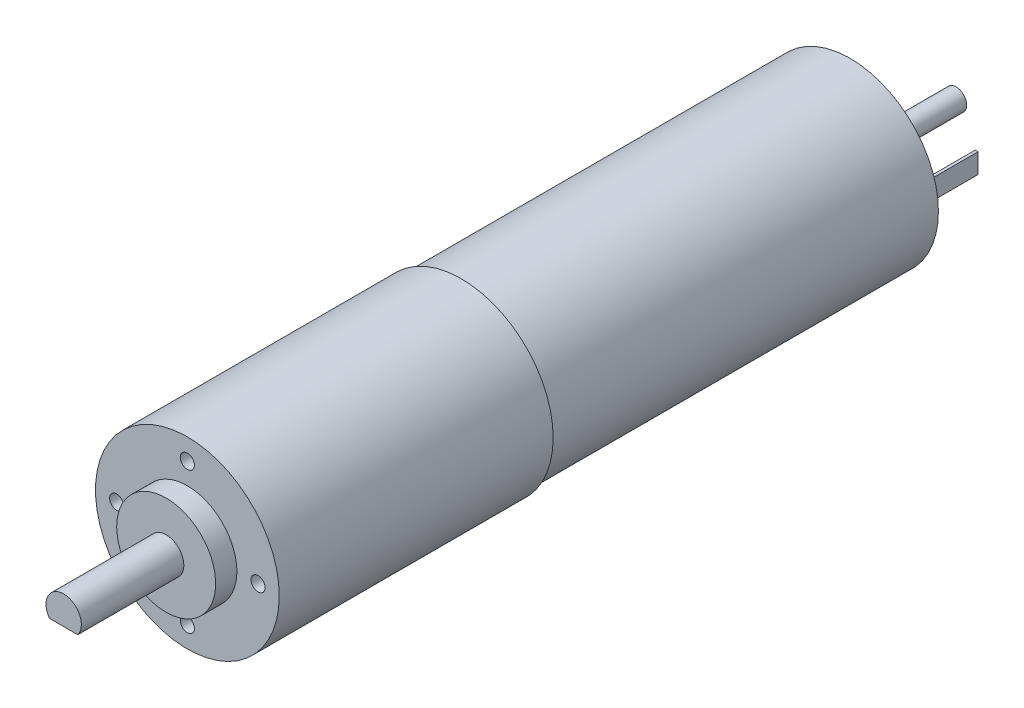
ISO-10303-21;
HEADER;
FILE_DESCRIPTION(('STEP AP214'),'2;1');
FILE_NAME('part.step','',(''),(''),'','','');
FILE_SCHEMA(('AUTOMOTIVE_DESIGN { 1 0 10303 214 1 1 1 1 }'));
ENDSEC;
DATA;
#1=APPLICATION_CONTEXT('core data for automotive mechanical design processes');
#2=APPLICATION_PROTOCOL_DEFINITION('international standard','automotive_design',2000,#1);
#3=PRODUCT_CONTEXT('',#1,'mechanical');
#4=PRODUCT('Part','Part','',(#3));
#5=PRODUCT_RELATED_PRODUCT_CATEGORY('part','',(#4));
#6=PRODUCT_DEFINITION_FORMATION('','',#4);
#7=PRODUCT_DEFINITION_CONTEXT('part definition',#1,'design');
#8=PRODUCT_DEFINITION('design','',#6,#7);
#9=PRODUCT_DEFINITION_SHAPE('','',#8);
#10=(LENGTH_UNIT() NAMED_UNIT(*) SI_UNIT(.MILLI.,.METRE.));
#11=(NAMED_UNIT(*) PLANE_ANGLE_UNIT() SI_UNIT($,.RADIAN.));
#12=(NAMED_UNIT(*) SI_UNIT($,.STERADIAN.) SOLID_ANGLE_UNIT());
#13=UNCERTAINTY_MEASURE_WITH_UNIT(LENGTH_MEASURE(1.E-05),#10,'distance_accuracy_value','');
#14=(GEOMETRIC_REPRESENTATION_CONTEXT(3) GLOBAL_UNCERTAINTY_ASSIGNED_CONTEXT((#13)) GLOBAL_UNIT_ASSIGNED_CONTEXT((#10,
#11,#12)) REPRESENTATION_CONTEXT('',''));
#15=CARTESIAN_POINT('',(0.,0.,0.));
#16=DIRECTION('',(0.,0.,1.));
#17=DIRECTION('',(1.,0.,0.));
#18=AXIS2_PLACEMENT_3D('',#15,#16,#17);
#19=CARTESIAN_POINT('',(0.,0.,0.));
#20=DIRECTION('',(0.,0.,1.));
#21=DIRECTION('',(1.,0.,0.));
#22=AXIS2_PLACEMENT_3D('',#19,#20,#21);
#23=PLANE('',#22);
#24=CARTESIAN_POINT('',(0.,0.,0.));
#25=DIRECTION('',(0.,0.,1.));
#26=DIRECTION('',(1.,0.,0.));
#27=AXIS2_PLACEMENT_3D('',#24,#25,#26);
#28=CIRCLE('',#27,12.5);
#29=CARTESIAN_POINT('',(12.5,0.,0.));
#30=VERTEX_POINT('',#29);
#31=EDGE_CURVE('E246',#30,#30,#28,.T.);
#32=ORIENTED_EDGE('',*,*,#31,.F.);
#33=EDGE_LOOP('',(#32));
#34=FACE_BOUND('',#33,.T.);
#35=CARTESIAN_POINT('',(0.,0.,0.));
#36=DIRECTION('',(0.,0.,-1.));
#37=DIRECTION('',(-1.,0.,0.));
#38=AXIS2_PLACEMENT_3D('',#35,#36,#37);
#39=CIRCLE('',#38,4.);
#40=CARTESIAN_POINT('',(-4.,0.,0.));
#41=VERTEX_POINT('',#40);
#42=EDGE_CURVE('E11',#41,#41,#39,.T.);
#43=ORIENTED_EDGE('',*,*,#42,.F.);
#44=EDGE_LOOP('',(#43));
#45=FACE_BOUND('',#44,.T.);
#46=DIRECTION('',(1.,0.,0.));
#47=VECTOR('',#46,1.);
#48=CARTESIAN_POINT('',(0.,-1.40000000000001,0.));
#49=LINE('',#48,#47);
#50=CARTESIAN_POINT('',(-9.4,-1.4,0.));
#51=VERTEX_POINT('',#50);
#52=CARTESIAN_POINT('',(-9.,-1.4,0.));
#53=VERTEX_POINT('',#52);
#54=EDGE_CURVE('E186',#51,#53,#49,.T.);
#55=ORIENTED_EDGE('',*,*,#54,.T.);
#56=DIRECTION('',(0.,1.,0.));
#57=VECTOR('',#56,1.);
#58=CARTESIAN_POINT('',(-9.,0.,0.));
#59=LINE('',#58,#57);
#60=CARTESIAN_POINT('',(-9.,1.4,0.));
#61=VERTEX_POINT('',#60);
#62=EDGE_CURVE('E169',#53,#61,#59,.T.);
#63=ORIENTED_EDGE('',*,*,#62,.T.);
#64=DIRECTION('',(-1.,0.,0.));
#65=VECTOR('',#64,1.);
#66=CARTESIAN_POINT('',(0.,1.40000000000001,0.));
#67=LINE('',#66,#65);
#68=CARTESIAN_POINT('',(-9.4,1.4,0.));
#69=VERTEX_POINT('',#68);
#70=EDGE_CURVE('E174',#61,#69,#67,.T.);
#71=ORIENTED_EDGE('',*,*,#70,.T.);
#72=DIRECTION('',(0.,-1.,0.));
#73=VECTOR('',#72,1.);
#74=CARTESIAN_POINT('',(-9.4,0.,0.));
#75=LINE('',#74,#73);
#76=EDGE_CURVE('E189',#69,#51,#75,.T.);
#77=ORIENTED_EDGE('',*,*,#76,.T.);
#78=EDGE_LOOP('',(#55,#63,#71,#77));
#79=FACE_BOUND('',#78,.T.);
#80=DIRECTION('',(-1.,0.,0.));
#81=VECTOR('',#80,1.);
#82=CARTESIAN_POINT('',(0.,-1.40000000000001,0.));
#83=LINE('',#82,#81);
#84=CARTESIAN_POINT('',(9.4,-1.4,0.));
#85=VERTEX_POINT('',#84);
#86=CARTESIAN_POINT('',(9.,-1.4,0.));
#87=VERTEX_POINT('',#86);
#88=EDGE_CURVE('E136',#85,#87,#83,.T.);
#89=ORIENTED_EDGE('',*,*,#88,.F.);
#90=DIRECTION('',(0.,-1.,0.));
#91=VECTOR('',#90,1.);
#92=CARTESIAN_POINT('',(9.4,0.,0.));
#93=LINE('',#92,#91);
#94=CARTESIAN_POINT('',(9.4,1.4,0.));
#95=VERTEX_POINT('',#94);
#96=EDGE_CURVE('E144',#95,#85,#93,.T.);
#97=ORIENTED_EDGE('',*,*,#96,.F.);
#98=DIRECTION('',(1.,0.,0.));
#99=VECTOR('',#98,1.);
#100=CARTESIAN_POINT('',(0.,1.40000000000001,0.));
#101=LINE('',#100,#99);
#102=CARTESIAN_POINT('',(9.,1.4,0.));
#103=VERTEX_POINT('',#102);
#104=EDGE_CURVE('E154',#103,#95,#101,.T.);
#105=ORIENTED_EDGE('',*,*,#104,.F.);
#106=DIRECTION('',(0.,1.,0.));
#107=VECTOR('',#106,1.);
#108=CARTESIAN_POINT('',(9.,0.,0.));
#109=LINE('',#108,#107);
#110=EDGE_CURVE('E65',#87,#103,#109,.T.);
#111=ORIENTED_EDGE('',*,*,#110,.F.);
#112=EDGE_LOOP('',(#89,#97,#105,#111));
#113=FACE_BOUND('',#112,.T.);
#114=ADVANCED_FACE('F40',(#34,#45,#79,#113),#23,.F.);
#115=CARTESIAN_POINT('',(0.,0.,55.));
#116=DIRECTION('',(0.,0.,-1.));
#117=DIRECTION('',(-1.,0.,0.));
#118=AXIS2_PLACEMENT_3D('',#115,#116,#117);
#119=CYLINDRICAL_SURFACE('',#118,12.5);
#120=CARTESIAN_POINT('',(0.,0.,55.));
#121=DIRECTION('',(0.,0.,1.));
#122=DIRECTION('',(1.,0.,0.));
#123=AXIS2_PLACEMENT_3D('',#120,#121,#122);
#124=CIRCLE('',#123,12.5);
#125=CARTESIAN_POINT('',(12.5,0.,55.));
#126=VERTEX_POINT('',#125);
#127=EDGE_CURVE('E242',#126,#126,#124,.T.);
#128=ORIENTED_EDGE('',*,*,#127,.F.);
#129=EDGE_LOOP('',(#128));
#130=FACE_BOUND('',#129,.T.);
#131=ORIENTED_EDGE('',*,*,#31,.T.);
#132=EDGE_LOOP('',(#131));
#133=FACE_BOUND('',#132,.T.);
#134=ADVANCED_FACE('F42',(#130,#133),#119,.T.);
#135=CARTESIAN_POINT('',(0.,0.,93.75));
#136=DIRECTION('',(0.,0.,-1.));
#137=DIRECTION('',(-1.,0.,0.));
#138=AXIS2_PLACEMENT_3D('',#135,#136,#137);
#139=CYLINDRICAL_SURFACE('',#138,13.);
#140=CARTESIAN_POINT('',(0.,0.,93.75));
#141=DIRECTION('',(0.,0.,1.));
#142=DIRECTION('',(1.,0.,0.));
#143=AXIS2_PLACEMENT_3D('',#140,#141,#142);
#144=CIRCLE('',#143,13.);
#145=CARTESIAN_POINT('',(13.,0.,93.75));
#146=VERTEX_POINT('',#145);
#147=EDGE_CURVE('E243',#146,#146,#144,.T.);
#148=ORIENTED_EDGE('',*,*,#147,.F.);
#149=EDGE_LOOP('',(#148));
#150=FACE_BOUND('',#149,.T.);
#151=CARTESIAN_POINT('',(0.,0.,55.));
#152=DIRECTION('',(0.,0.,1.));
#153=DIRECTION('',(1.,0.,0.));
#154=AXIS2_PLACEMENT_3D('',#151,#152,#153);
#155=CIRCLE('',#154,13.);
#156=CARTESIAN_POINT('',(13.,0.,55.));
#157=VERTEX_POINT('',#156);
#158=EDGE_CURVE('E239',#157,#157,#155,.T.);
#159=ORIENTED_EDGE('',*,*,#158,.T.);
#160=EDGE_LOOP('',(#159));
#161=FACE_BOUND('',#160,.T.);
#162=ADVANCED_FACE('F372',(#150,#161),#139,.T.);
#163=CARTESIAN_POINT('',(0.,0.,93.75));
#164=DIRECTION('',(0.,0.,1.));
#165=DIRECTION('',(1.,0.,0.));
#166=AXIS2_PLACEMENT_3D('',#163,#164,#165);
#167=PLANE('',#166);
#168=CARTESIAN_POINT('',(0.,10.,93.75));
#169=DIRECTION('',(0.,0.,1.));
#170=DIRECTION('',(1.,0.,0.));
#171=AXIS2_PLACEMENT_3D('',#168,#169,#170);
#172=CIRCLE('',#171,1.);
#173=CARTESIAN_POINT('',(1.,10.,93.75));
#174=VERTEX_POINT('',#173);
#175=EDGE_CURVE('E212',#174,#174,#172,.T.);
#176=ORIENTED_EDGE('',*,*,#175,.F.);
#177=EDGE_LOOP('',(#176));
#178=FACE_BOUND('',#177,.T.);
#179=CARTESIAN_POINT('',(10.,0.,93.75));
#180=DIRECTION('',(0.,0.,1.));
#181=DIRECTION('',(1.,0.,0.));
#182=AXIS2_PLACEMENT_3D('',#179,#180,#181);
#183=CIRCLE('',#182,0.999999999999999);
#184=CARTESIAN_POINT('',(11.,0.,93.75));
#185=VERTEX_POINT('',#184);
#186=EDGE_CURVE('E218',#185,#185,#183,.T.);
#187=ORIENTED_EDGE('',*,*,#186,.F.);
#188=EDGE_LOOP('',(#187));
#189=FACE_BOUND('',#188,.T.);
#190=CARTESIAN_POINT('',(0.,-10.,93.75));
#191=DIRECTION('',(0.,0.,1.));
#192=DIRECTION('',(1.,0.,0.));
#193=AXIS2_PLACEMENT_3D('',#190,#191,#192);
#194=CIRCLE('',#193,1.);
#195=CARTESIAN_POINT('',(1.,-10.,93.75));
#196=VERTEX_POINT('',#195);
#197=EDGE_CURVE('E224',#196,#196,#194,.T.);
#198=ORIENTED_EDGE('',*,*,#197,.F.);
#199=EDGE_LOOP('',(#198));
#200=FACE_BOUND('',#199,.T.);
#201=CARTESIAN_POINT('',(-10.,0.,93.75));
#202=DIRECTION('',(0.,0.,1.));
#203=DIRECTION('',(1.,0.,0.));
#204=AXIS2_PLACEMENT_3D('',#201,#202,#203);
#205=CIRCLE('',#204,0.999999999999999);
#206=CARTESIAN_POINT('',(-9.,0.,93.75));
#207=VERTEX_POINT('',#206);
#208=EDGE_CURVE('E207',#207,#207,#205,.T.);
#209=ORIENTED_EDGE('',*,*,#208,.F.);
#210=EDGE_LOOP('',(#209));
#211=FACE_BOUND('',#210,.T.);
#212=CARTESIAN_POINT('',(0.,0.,93.75));
#213=DIRECTION('',(0.,0.,1.));
#214=DIRECTION('',(1.,0.,0.));
#215=AXIS2_PLACEMENT_3D('',#212,#213,#214);
#216=CIRCLE('',#215,7.);
#217=CARTESIAN_POINT('',(-7.,0.,93.75));
#218=VERTEX_POINT('',#217);
#219=EDGE_CURVE('E236',#218,#218,#216,.T.);
#220=ORIENTED_EDGE('',*,*,#219,.F.);
#221=EDGE_LOOP('',(#220));
#222=FACE_BOUND('',#221,.T.);
#223=ORIENTED_EDGE('',*,*,#147,.T.);
#224=EDGE_LOOP('',(#223));
#225=FACE_BOUND('',#224,.T.);
#226=ADVANCED_FACE('F369',(#178,#189,#200,#211,#222,#225),#167,.T.);
#227=CARTESIAN_POINT('',(0.,0.,55.));
#228=DIRECTION('',(0.,0.,1.));
#229=DIRECTION('',(1.,0.,0.));
#230=AXIS2_PLACEMENT_3D('',#227,#228,#229);
#231=PLANE('',#230);
#232=ORIENTED_EDGE('',*,*,#127,.T.);
#233=EDGE_LOOP('',(#232));
#234=FACE_BOUND('',#233,.T.);
#235=ORIENTED_EDGE('',*,*,#158,.F.);
#236=EDGE_LOOP('',(#235));
#237=FACE_BOUND('',#236,.T.);
#238=ADVANCED_FACE('F367',(#234,#237),#231,.F.);
#239=CARTESIAN_POINT('',(0.,0.,96.75));
#240=DIRECTION('',(0.,0.,-1.));
#241=DIRECTION('',(-1.,0.,0.));
#242=AXIS2_PLACEMENT_3D('',#239,#240,#241);
#243=CYLINDRICAL_SURFACE('',#242,7.);
#244=CARTESIAN_POINT('',(0.,0.,96.75));
#245=DIRECTION('',(0.,0.,1.));
#246=DIRECTION('',(1.,0.,0.));
#247=AXIS2_PLACEMENT_3D('',#244,#245,#246);
#248=CIRCLE('',#247,7.);
#249=CARTESIAN_POINT('',(-7.,0.,96.75));
#250=VERTEX_POINT('',#249);
#251=EDGE_CURVE('E233',#250,#250,#248,.T.);
#252=CARTESIAN_POINT('',(-7.,0.,96.75));
#253=CARTESIAN_POINT('',(-7.,0.,96.71875));
#254=CARTESIAN_POINT('',(-7.,0.,96.6875));
#255=CARTESIAN_POINT('',(-7.,0.,96.625));
#256=CARTESIAN_POINT('',(-7.,0.,96.59375));
#257=CARTESIAN_POINT('',(-7.,0.,96.53125));
#258=CARTESIAN_POINT('',(-7.,0.,96.5));
#259=CARTESIAN_POINT('',(-7.,0.,96.4375));
#260=CARTESIAN_POINT('',(-7.,0.,96.40625));
#261=CARTESIAN_POINT('',(-7.,0.,96.34375));
#262=CARTESIAN_POINT('',(-7.,0.,96.3125));
#263=CARTESIAN_POINT('',(-7.,0.,96.25));
#264=CARTESIAN_POINT('',(-7.,0.,96.21875));
#265=CARTESIAN_POINT('',(-7.,0.,96.15625));
#266=CARTESIAN_POINT('',(-7.,0.,96.125));
#267=CARTESIAN_POINT('',(-7.,0.,96.0625));
#268=CARTESIAN_POINT('',(-7.,0.,96.03125));
#269=CARTESIAN_POINT('',(-7.,0.,95.96875));
#270=CARTESIAN_POINT('',(-7.,0.,95.9375));
#271=CARTESIAN_POINT('',(-7.,0.,95.875));
#272=CARTESIAN_POINT('',(-7.,0.,95.84375));
#273=CARTESIAN_POINT('',(-7.,0.,95.78125));
#274=CARTESIAN_POINT('',(-7.,0.,95.75));
#275=CARTESIAN_POINT('',(-7.,0.,95.6875));
#276=CARTESIAN_POINT('',(-7.,0.,95.65625));
#277=CARTESIAN_POINT('',(-7.,0.,95.59375));
#278=CARTESIAN_POINT('',(-7.,0.,95.5625));
#279=CARTESIAN_POINT('',(-7.,0.,95.5));
#280=CARTESIAN_POINT('',(-7.,0.,95.46875));
#281=CARTESIAN_POINT('',(-7.,0.,95.40625));
#282=CARTESIAN_POINT('',(-7.,0.,95.375));
#283=CARTESIAN_POINT('',(-7.,0.,95.3125));
#284=CARTESIAN_POINT('',(-7.,0.,95.28125));
#285=CARTESIAN_POINT('',(-7.,0.,95.21875));
#286=CARTESIAN_POINT('',(-7.,0.,95.1875));
#287=CARTESIAN_POINT('',(-7.,0.,95.125));
#288=CARTESIAN_POINT('',(-7.,0.,95.09375));
#289=CARTESIAN_POINT('',(-7.,0.,95.03125));
#290=CARTESIAN_POINT('',(-7.,0.,95.));
#291=CARTESIAN_POINT('',(-7.,0.,94.9375));
#292=CARTESIAN_POINT('',(-7.,0.,94.90625));
#293=CARTESIAN_POINT('',(-7.,0.,94.84375));
#294=CARTESIAN_POINT('',(-7.,0.,94.8125));
#295=CARTESIAN_POINT('',(-7.,0.,94.75));
#296=CARTESIAN_POINT('',(-7.,0.,94.71875));
#297=CARTESIAN_POINT('',(-7.,0.,94.65625));
#298=CARTESIAN_POINT('',(-7.,0.,94.625));
#299=CARTESIAN_POINT('',(-7.,0.,94.5625));
#300=CARTESIAN_POINT('',(-7.,0.,94.53125));
#301=CARTESIAN_POINT('',(-7.,0.,94.46875));
#302=CARTESIAN_POINT('',(-7.,0.,94.4375));
#303=CARTESIAN_POINT('',(-7.,0.,94.375));
#304=CARTESIAN_POINT('',(-7.,0.,94.34375));
#305=CARTESIAN_POINT('',(-7.,0.,94.28125));
#306=CARTESIAN_POINT('',(-7.,0.,94.25));
#307=CARTESIAN_POINT('',(-7.,0.,94.1875));
#308=CARTESIAN_POINT('',(-7.,0.,94.15625));
#309=CARTESIAN_POINT('',(-7.,0.,94.09375));
#310=CARTESIAN_POINT('',(-7.,0.,94.0625));
#311=CARTESIAN_POINT('',(-7.,0.,94.));
#312=CARTESIAN_POINT('',(-7.,0.,93.96875));
#313=CARTESIAN_POINT('',(-7.,0.,93.90625));
#314=CARTESIAN_POINT('',(-7.,0.,93.875));
#315=CARTESIAN_POINT('',(-7.,0.,93.8125));
#316=CARTESIAN_POINT('',(-7.,0.,93.78125));
#317=CARTESIAN_POINT('',(-7.,0.,93.75));
#318=B_SPLINE_CURVE_WITH_KNOTS('',3,(#252,#253,#254,#255,#256,#257,#258,#259,#260,#261,#262,
#263,#264,#265,#266,#267,#268,#269,#270,#271,#272,#273,#274,#275,#276,#277,#278,#279,#280,#281,
#282,#283,#284,#285,#286,#287,#288,#289,#290,#291,#292,#293,#294,#295,#296,#297,#298,#299,#300,
#301,#302,#303,#304,#305,#306,#307,#308,#309,#310,#311,#312,#313,#314,#315,#316,#317),
.UNSPECIFIED.,.F.,.F.,(4,2,2,2,2,2,2,2,2,2,2,2,2,2,2,2,2,2,2,2,2,2,2,2,2,2,2,2,2,2,2,2,4),(0.,
0.0937499999999897,0.187499999999993,0.281249999999997,0.375,0.46874999999999,0.562499999999994,
0.656249999999997,0.750000000000001,0.84374999999999,0.937499999999994,1.03125,1.125,
1.21874999999999,1.31249999999999,1.40625,1.5,1.59374999999999,1.68749999999999,1.78125,1.875,
1.96874999999999,2.06249999999999,2.15625,2.25,2.34374999999999,2.4375,2.53125,2.625,
2.71874999999999,2.8125,2.90625,3.),.UNSPECIFIED.);
#319=EDGE_CURVE('BSEAM363',#250,#218,#318,.T.);
#320=ORIENTED_EDGE('',*,*,#251,.F.);
#321=ORIENTED_EDGE('',*,*,#219,.T.);
#322=ORIENTED_EDGE('',*,*,#319,.T.);
#323=ORIENTED_EDGE('',*,*,#319,.F.);
#324=EDGE_LOOP('',(#320,#322,#321,#323));
#325=FACE_BOUND('',#324,.T.);
#326=ADVANCED_FACE('F363',(#325),#243,.T.);
#327=CARTESIAN_POINT('',(0.,0.,96.75));
#328=DIRECTION('',(0.,0.,1.));
#329=DIRECTION('',(1.,0.,0.));
#330=AXIS2_PLACEMENT_3D('',#327,#328,#329);
#331=PLANE('',#330);
#332=CARTESIAN_POINT('',(0.,0.,96.75));
#333=DIRECTION('',(0.,0.,1.));
#334=DIRECTION('',(1.,0.,0.));
#335=AXIS2_PLACEMENT_3D('',#332,#333,#334);
#336=CIRCLE('',#335,2.5);
#337=CARTESIAN_POINT('',(2.5,0.,96.75));
#338=VERTEX_POINT('',#337);
#339=EDGE_CURVE('E49',#338,#338,#336,.T.);
#340=ORIENTED_EDGE('',*,*,#339,.F.);
#341=EDGE_LOOP('',(#340));
#342=FACE_BOUND('',#341,.T.);
#343=ORIENTED_EDGE('',*,*,#251,.T.);
#344=EDGE_LOOP('',(#343));
#345=FACE_BOUND('',#344,.T.);
#346=ADVANCED_FACE('F360',(#342,#345),#331,.T.);
#347=CARTESIAN_POINT('',(0.,0.,111.25));
#348=DIRECTION('',(0.,0.,-1.));
#349=DIRECTION('',(-1.,0.,0.));
#350=AXIS2_PLACEMENT_3D('',#347,#348,#349);
#351=CYLINDRICAL_SURFACE('',#350,2.5);
#352=CARTESIAN_POINT('',(0.,0.,111.25));
#353=DIRECTION('',(0.,0.,1.));
#354=DIRECTION('',(1.,0.,0.));
#355=AXIS2_PLACEMENT_3D('',#352,#353,#354);
#356=CIRCLE('',#355,2.5);
#357=CARTESIAN_POINT('',(2.,-1.5,111.25));
#358=VERTEX_POINT('',#357);
#359=CARTESIAN_POINT('',(-2.,-1.5,111.25));
#360=VERTEX_POINT('',#359);
#361=EDGE_CURVE('E134',#358,#360,#356,.T.);
#362=ORIENTED_EDGE('',*,*,#361,.F.);
#363=DIRECTION('',(0.,0.,1.));
#364=VECTOR('',#363,1.);
#365=CARTESIAN_POINT('',(2.,-1.5,101.25));
#366=LINE('',#365,#364);
#367=CARTESIAN_POINT('',(2.,-1.5,101.25));
#368=VERTEX_POINT('',#367);
#369=EDGE_CURVE('E57',#368,#358,#366,.T.);
#370=ORIENTED_EDGE('',*,*,#369,.F.);
#371=CARTESIAN_POINT('',(0.,0.,101.25));
#372=DIRECTION('',(0.,0.,1.));
#373=DIRECTION('',(1.,0.,0.));
#374=AXIS2_PLACEMENT_3D('',#371,#372,#373);
#375=CIRCLE('',#374,2.5);
#376=CARTESIAN_POINT('',(-2.,-1.5,101.25));
#377=VERTEX_POINT('',#376);
#378=EDGE_CURVE('E120',#377,#368,#375,.T.);
#379=ORIENTED_EDGE('',*,*,#378,.F.);
#380=DIRECTION('',(0.,0.,1.));
#381=VECTOR('',#380,1.);
#382=CARTESIAN_POINT('',(-2.,-1.5,101.25));
#383=LINE('',#382,#381);
#384=EDGE_CURVE('E128',#377,#360,#383,.T.);
#385=ORIENTED_EDGE('',*,*,#384,.T.);
#386=EDGE_LOOP('',(#362,#370,#379,#385));
#387=FACE_BOUND('',#386,.T.);
#388=ORIENTED_EDGE('',*,*,#339,.T.);
#389=EDGE_LOOP('',(#388));
#390=FACE_BOUND('',#389,.T.);
#391=ADVANCED_FACE('F131',(#387,#390),#351,.T.);
#392=CARTESIAN_POINT('',(0.,0.,111.25));
#393=DIRECTION('',(0.,0.,1.));
#394=DIRECTION('',(1.,0.,0.));
#395=AXIS2_PLACEMENT_3D('',#392,#393,#394);
#396=PLANE('',#395);
#397=DIRECTION('',(-1.,0.,0.));
#398=VECTOR('',#397,1.);
#399=CARTESIAN_POINT('',(0.,-1.5,111.25));
#400=LINE('',#399,#398);
#401=EDGE_CURVE('E125',#358,#360,#400,.T.);
#402=ORIENTED_EDGE('',*,*,#401,.F.);
#403=ORIENTED_EDGE('',*,*,#361,.T.);
#404=EDGE_LOOP('',(#402,#403));
#405=FACE_BOUND('',#404,.T.);
#406=ADVANCED_FACE('F353',(#405),#396,.T.);
#407=CARTESIAN_POINT('',(-10.,0.,89.75));
#408=DIRECTION('',(0.,0.,1.));
#409=DIRECTION('',(1.,0.,0.));
#410=AXIS2_PLACEMENT_3D('',#407,#408,#409);
#411=CYLINDRICAL_SURFACE('',#410,0.999999999999999);
#412=CARTESIAN_POINT('',(-10.,0.,89.75));
#413=DIRECTION('',(0.,0.,1.));
#414=DIRECTION('',(1.,0.,0.));
#415=AXIS2_PLACEMENT_3D('',#412,#413,#414);
#416=CIRCLE('',#415,0.999999999999999);
#417=CARTESIAN_POINT('',(-9.,0.,89.75));
#418=VERTEX_POINT('',#417);
#419=EDGE_CURVE('E227',#418,#418,#416,.T.);
#420=ORIENTED_EDGE('',*,*,#419,.F.);
#421=EDGE_LOOP('',(#420));
#422=FACE_BOUND('',#421,.T.);
#423=ORIENTED_EDGE('',*,*,#208,.T.);
#424=EDGE_LOOP('',(#423));
#425=FACE_BOUND('',#424,.T.);
#426=ADVANCED_FACE('F349',(#422,#425),#411,.F.);
#427=CARTESIAN_POINT('',(0.,0.,89.75));
#428=DIRECTION('',(0.,0.,1.));
#429=DIRECTION('',(1.,0.,0.));
#430=AXIS2_PLACEMENT_3D('',#427,#428,#429);
#431=PLANE('',#430);
#432=ORIENTED_EDGE('',*,*,#419,.T.);
#433=EDGE_LOOP('',(#432));
#434=FACE_BOUND('',#433,.T.);
#435=ADVANCED_FACE('F345',(#434),#431,.T.);
#436=CARTESIAN_POINT('',(0.,-10.,89.75));
#437=DIRECTION('',(0.,0.,1.));
#438=DIRECTION('',(1.,0.,0.));
#439=AXIS2_PLACEMENT_3D('',#436,#437,#438);
#440=CYLINDRICAL_SURFACE('',#439,1.);
#441=CARTESIAN_POINT('',(0.,-10.,89.75));
#442=DIRECTION('',(0.,0.,1.));
#443=DIRECTION('',(1.,0.,0.));
#444=AXIS2_PLACEMENT_3D('',#441,#442,#443);
#445=CIRCLE('',#444,1.);
#446=CARTESIAN_POINT('',(1.,-10.,89.75));
#447=VERTEX_POINT('',#446);
#448=EDGE_CURVE('E221',#447,#447,#445,.T.);
#449=ORIENTED_EDGE('',*,*,#448,.F.);
#450=EDGE_LOOP('',(#449));
#451=FACE_BOUND('',#450,.T.);
#452=ORIENTED_EDGE('',*,*,#197,.T.);
#453=EDGE_LOOP('',(#452));
#454=FACE_BOUND('',#453,.T.);
#455=ADVANCED_FACE('F341',(#451,#454),#440,.F.);
#456=CARTESIAN_POINT('',(0.,0.,89.75));
#457=DIRECTION('',(0.,0.,1.));
#458=DIRECTION('',(1.,0.,0.));
#459=AXIS2_PLACEMENT_3D('',#456,#457,#458);
#460=PLANE('',#459);
#461=ORIENTED_EDGE('',*,*,#448,.T.);
#462=EDGE_LOOP('',(#461));
#463=FACE_BOUND('',#462,.T.);
#464=ADVANCED_FACE('F337',(#463),#460,.T.);
#465=CARTESIAN_POINT('',(10.,0.,89.75));
#466=DIRECTION('',(0.,0.,1.));
#467=DIRECTION('',(1.,0.,0.));
#468=AXIS2_PLACEMENT_3D('',#465,#466,#467);
#469=CYLINDRICAL_SURFACE('',#468,0.999999999999999);
#470=CARTESIAN_POINT('',(10.,0.,89.75));
#471=DIRECTION('',(0.,0.,1.));
#472=DIRECTION('',(1.,0.,0.));
#473=AXIS2_PLACEMENT_3D('',#470,#471,#472);
#474=CIRCLE('',#473,0.999999999999999);
#475=CARTESIAN_POINT('',(11.,0.,89.75));
#476=VERTEX_POINT('',#475);
#477=EDGE_CURVE('E215',#476,#476,#474,.T.);
#478=ORIENTED_EDGE('',*,*,#477,.F.);
#479=EDGE_LOOP('',(#478));
#480=FACE_BOUND('',#479,.T.);
#481=ORIENTED_EDGE('',*,*,#186,.T.);
#482=EDGE_LOOP('',(#481));
#483=FACE_BOUND('',#482,.T.);
#484=ADVANCED_FACE('F333',(#480,#483),#469,.F.);
#485=CARTESIAN_POINT('',(0.,0.,89.75));
#486=DIRECTION('',(0.,0.,1.));
#487=DIRECTION('',(1.,0.,0.));
#488=AXIS2_PLACEMENT_3D('',#485,#486,#487);
#489=PLANE('',#488);
#490=ORIENTED_EDGE('',*,*,#477,.T.);
#491=EDGE_LOOP('',(#490));
#492=FACE_BOUND('',#491,.T.);
#493=ADVANCED_FACE('F329',(#492),#489,.T.);
#494=CARTESIAN_POINT('',(0.,10.,89.75));
#495=DIRECTION('',(0.,0.,1.));
#496=DIRECTION('',(1.,0.,0.));
#497=AXIS2_PLACEMENT_3D('',#494,#495,#496);
#498=CYLINDRICAL_SURFACE('',#497,1.);
#499=CARTESIAN_POINT('',(0.,10.,89.75));
#500=DIRECTION('',(0.,0.,1.));
#501=DIRECTION('',(1.,0.,0.));
#502=AXIS2_PLACEMENT_3D('',#499,#500,#501);
#503=CIRCLE('',#502,1.);
#504=CARTESIAN_POINT('',(1.,10.,89.75));
#505=VERTEX_POINT('',#504);
#506=EDGE_CURVE('E209',#505,#505,#503,.T.);
#507=ORIENTED_EDGE('',*,*,#506,.F.);
#508=EDGE_LOOP('',(#507));
#509=FACE_BOUND('',#508,.T.);
#510=ORIENTED_EDGE('',*,*,#175,.T.);
#511=EDGE_LOOP('',(#510));
#512=FACE_BOUND('',#511,.T.);
#513=ADVANCED_FACE('F325',(#509,#512),#498,.F.);
#514=CARTESIAN_POINT('',(0.,0.,89.75));
#515=DIRECTION('',(0.,0.,1.));
#516=DIRECTION('',(1.,0.,0.));
#517=AXIS2_PLACEMENT_3D('',#514,#515,#516);
#518=PLANE('',#517);
#519=ORIENTED_EDGE('',*,*,#506,.T.);
#520=EDGE_LOOP('',(#519));
#521=FACE_BOUND('',#520,.T.);
#522=ADVANCED_FACE('F321',(#521),#518,.T.);
#523=CARTESIAN_POINT('',(0.,0.,-2.75));
#524=DIRECTION('',(0.,0.,1.));
#525=DIRECTION('',(1.,0.,0.));
#526=AXIS2_PLACEMENT_3D('',#523,#524,#525);
#527=CYLINDRICAL_SURFACE('',#526,4.);
#528=CARTESIAN_POINT('',(0.,0.,-2.75));
#529=DIRECTION('',(0.,0.,-1.));
#530=DIRECTION('',(-1.,0.,0.));
#531=AXIS2_PLACEMENT_3D('',#528,#529,#530);
#532=CIRCLE('',#531,4.);
#533=CARTESIAN_POINT('',(-4.,0.,-2.75));
#534=VERTEX_POINT('',#533);
#535=EDGE_CURVE('E205',#534,#534,#532,.T.);
#536=ORIENTED_EDGE('',*,*,#535,.F.);
#537=EDGE_LOOP('',(#536));
#538=FACE_BOUND('',#537,.T.);
#539=ORIENTED_EDGE('',*,*,#42,.T.);
#540=EDGE_LOOP('',(#539));
#541=FACE_BOUND('',#540,.T.);
#542=ADVANCED_FACE('F317',(#538,#541),#527,.T.);
#543=CARTESIAN_POINT('',(0.,0.,-2.75));
#544=DIRECTION('',(0.,0.,-1.));
#545=DIRECTION('',(-1.,0.,0.));
#546=AXIS2_PLACEMENT_3D('',#543,#544,#545);
#547=PLANE('',#546);
#548=CARTESIAN_POINT('',(0.,0.,-2.75));
#549=DIRECTION('',(0.,0.,-1.));
#550=DIRECTION('',(-1.,0.,0.));
#551=AXIS2_PLACEMENT_3D('',#548,#549,#550);
#552=CIRCLE('',#551,1.5);
#553=CARTESIAN_POINT('',(-1.5,0.,-2.75));
#554=VERTEX_POINT('',#553);
#555=EDGE_CURVE('E44',#554,#554,#552,.F.);
#556=ORIENTED_EDGE('',*,*,#555,.T.);
#557=EDGE_LOOP('',(#556));
#558=FACE_BOUND('',#557,.T.);
#559=ORIENTED_EDGE('',*,*,#535,.T.);
#560=EDGE_LOOP('',(#559));
#561=FACE_BOUND('',#560,.T.);
#562=ADVANCED_FACE('F313',(#558,#561),#547,.T.);
#563=CARTESIAN_POINT('',(0.,0.,-15.));
#564=DIRECTION('',(0.,0.,1.));
#565=DIRECTION('',(1.,0.,0.));
#566=AXIS2_PLACEMENT_3D('',#563,#564,#565);
#567=CYLINDRICAL_SURFACE('',#566,1.5);
#568=ORIENTED_EDGE('',*,*,#555,.F.);
#569=EDGE_LOOP('',(#568));
#570=FACE_BOUND('',#569,.T.);
#571=CARTESIAN_POINT('',(0.,0.,-15.));
#572=DIRECTION('',(0.,0.,-1.));
#573=DIRECTION('',(-1.,0.,0.));
#574=AXIS2_PLACEMENT_3D('',#571,#572,#573);
#575=CIRCLE('',#574,1.5);
#576=CARTESIAN_POINT('',(-1.5,0.,-15.));
#577=VERTEX_POINT('',#576);
#578=EDGE_CURVE('E202',#577,#577,#575,.T.);
#579=ORIENTED_EDGE('',*,*,#578,.F.);
#580=EDGE_LOOP('',(#579));
#581=FACE_BOUND('',#580,.T.);
#582=ADVANCED_FACE('F309',(#570,#581),#567,.T.);
#583=CARTESIAN_POINT('',(0.,0.,-15.));
#584=DIRECTION('',(0.,0.,-1.));
#585=DIRECTION('',(-1.,0.,0.));
#586=AXIS2_PLACEMENT_3D('',#583,#584,#585);
#587=PLANE('',#586);
#588=ORIENTED_EDGE('',*,*,#578,.T.);
#589=EDGE_LOOP('',(#588));
#590=FACE_BOUND('',#589,.T.);
#591=ADVANCED_FACE('F305',(#590),#587,.T.);
#592=CARTESIAN_POINT('',(-9.,0.,-8.7));
#593=DIRECTION('',(1.,0.,0.));
#594=DIRECTION('',(0.,0.,-1.));
#595=AXIS2_PLACEMENT_3D('',#592,#593,#594);
#596=PLANE('',#595);
#597=ORIENTED_EDGE('',*,*,#62,.F.);
#598=DIRECTION('',(0.,0.,1.));
#599=VECTOR('',#598,1.);
#600=CARTESIAN_POINT('',(-9.,-1.4,-8.7));
#601=LINE('',#600,#599);
#602=CARTESIAN_POINT('',(-9.,-1.4,-8.7));
#603=VERTEX_POINT('',#602);
#604=EDGE_CURVE('E200',#603,#53,#601,.T.);
#605=ORIENTED_EDGE('',*,*,#604,.F.);
#606=DIRECTION('',(0.,1.,0.));
#607=VECTOR('',#606,1.);
#608=CARTESIAN_POINT('',(-9.,0.,-8.7));
#609=LINE('',#608,#607);
#610=CARTESIAN_POINT('',(-9.,1.4,-8.7));
#611=VERTEX_POINT('',#610);
#612=EDGE_CURVE('E170',#603,#611,#609,.T.);
#613=ORIENTED_EDGE('',*,*,#612,.T.);
#614=DIRECTION('',(0.,0.,1.));
#615=VECTOR('',#614,1.);
#616=CARTESIAN_POINT('',(-9.,1.4,-8.7));
#617=LINE('',#616,#615);
#618=EDGE_CURVE('E183',#611,#61,#617,.T.);
#619=ORIENTED_EDGE('',*,*,#618,.T.);
#620=EDGE_LOOP('',(#597,#605,#613,#619));
#621=FACE_BOUND('',#620,.T.);
#622=ADVANCED_FACE('F301',(#621),#596,.T.);
#623=CARTESIAN_POINT('',(0.,-1.40000000000001,-8.7));
#624=DIRECTION('',(0.,-1.,0.));
#625=DIRECTION('',(1.,0.,0.));
#626=AXIS2_PLACEMENT_3D('',#623,#624,#625);
#627=PLANE('',#626);
#628=ORIENTED_EDGE('',*,*,#54,.F.);
#629=DIRECTION('',(0.,0.,1.));
#630=VECTOR('',#629,1.);
#631=CARTESIAN_POINT('',(-9.4,-1.4,-8.7));
#632=LINE('',#631,#630);
#633=CARTESIAN_POINT('',(-9.4,-1.4,-8.7));
#634=VERTEX_POINT('',#633);
#635=EDGE_CURVE('E198',#634,#51,#632,.T.);
#636=ORIENTED_EDGE('',*,*,#635,.F.);
#637=DIRECTION('',(1.,0.,0.));
#638=VECTOR('',#637,1.);
#639=CARTESIAN_POINT('',(0.,-1.40000000000001,-8.7));
#640=LINE('',#639,#638);
#641=EDGE_CURVE('E173',#634,#603,#640,.T.);
#642=ORIENTED_EDGE('',*,*,#641,.T.);
#643=ORIENTED_EDGE('',*,*,#604,.T.);
#644=EDGE_LOOP('',(#628,#636,#642,#643));
#645=FACE_BOUND('',#644,.T.);
#646=ADVANCED_FACE('F297',(#645),#627,.T.);
#647=CARTESIAN_POINT('',(-9.4,0.,-8.7));
#648=DIRECTION('',(-1.,0.,0.));
#649=DIRECTION('',(0.,-1.,0.));
#650=AXIS2_PLACEMENT_3D('',#647,#648,#649);
#651=PLANE('',#650);
#652=ORIENTED_EDGE('',*,*,#76,.F.);
#653=DIRECTION('',(0.,0.,1.));
#654=VECTOR('',#653,1.);
#655=CARTESIAN_POINT('',(-9.4,1.4,-8.7));
#656=LINE('',#655,#654);
#657=CARTESIAN_POINT('',(-9.4,1.4,-8.7));
#658=VERTEX_POINT('',#657);
#659=EDGE_CURVE('E195',#658,#69,#656,.T.);
#660=ORIENTED_EDGE('',*,*,#659,.F.);
#661=DIRECTION('',(0.,-1.,0.));
#662=VECTOR('',#661,1.);
#663=CARTESIAN_POINT('',(-9.4,0.,-8.7));
#664=LINE('',#663,#662);
#665=EDGE_CURVE('E177',#658,#634,#664,.T.);
#666=ORIENTED_EDGE('',*,*,#665,.T.);
#667=ORIENTED_EDGE('',*,*,#635,.T.);
#668=EDGE_LOOP('',(#652,#660,#666,#667));
#669=FACE_BOUND('',#668,.T.);
#670=ADVANCED_FACE('F293',(#669),#651,.T.);
#671=CARTESIAN_POINT('',(0.,1.40000000000001,-8.7));
#672=DIRECTION('',(0.,1.,0.));
#673=DIRECTION('',(-1.,0.,0.));
#674=AXIS2_PLACEMENT_3D('',#671,#672,#673);
#675=PLANE('',#674);
#676=ORIENTED_EDGE('',*,*,#70,.F.);
#677=ORIENTED_EDGE('',*,*,#618,.F.);
#678=DIRECTION('',(-1.,0.,0.));
#679=VECTOR('',#678,1.);
#680=CARTESIAN_POINT('',(0.,1.40000000000001,-8.7));
#681=LINE('',#680,#679);
#682=EDGE_CURVE('E180',#611,#658,#681,.T.);
#683=ORIENTED_EDGE('',*,*,#682,.T.);
#684=ORIENTED_EDGE('',*,*,#659,.T.);
#685=EDGE_LOOP('',(#676,#677,#683,#684));
#686=FACE_BOUND('',#685,.T.);
#687=ADVANCED_FACE('F289',(#686),#675,.T.);
#688=CARTESIAN_POINT('',(0.,0.,-8.7));
#689=DIRECTION('',(0.,0.,-1.));
#690=DIRECTION('',(-1.,0.,0.));
#691=AXIS2_PLACEMENT_3D('',#688,#689,#690);
#692=PLANE('',#691);
#693=ORIENTED_EDGE('',*,*,#612,.F.);
#694=ORIENTED_EDGE('',*,*,#641,.F.);
#695=ORIENTED_EDGE('',*,*,#665,.F.);
#696=ORIENTED_EDGE('',*,*,#682,.F.);
#697=EDGE_LOOP('',(#693,#694,#695,#696));
#698=FACE_BOUND('',#697,.T.);
#699=ADVANCED_FACE('F283',(#698),#692,.T.);
#700=CARTESIAN_POINT('',(0.,-1.40000000000001,-8.7));
#701=DIRECTION('',(0.,1.,0.));
#702=DIRECTION('',(-1.,0.,0.));
#703=AXIS2_PLACEMENT_3D('',#700,#701,#702);
#704=PLANE('',#703);
#705=ORIENTED_EDGE('',*,*,#88,.T.);
#706=DIRECTION('',(0.,0.,1.));
#707=VECTOR('',#706,1.);
#708=CARTESIAN_POINT('',(9.,-1.4,-8.7));
#709=LINE('',#708,#707);
#710=CARTESIAN_POINT('',(9.,-1.4,-8.7));
#711=VERTEX_POINT('',#710);
#712=EDGE_CURVE('E167',#711,#87,#709,.T.);
#713=ORIENTED_EDGE('',*,*,#712,.F.);
#714=DIRECTION('',(-1.,0.,0.));
#715=VECTOR('',#714,1.);
#716=CARTESIAN_POINT('',(0.,-1.40000000000001,-8.7));
#717=LINE('',#716,#715);
#718=CARTESIAN_POINT('',(9.4,-1.4,-8.7));
#719=VERTEX_POINT('',#718);
#720=EDGE_CURVE('E140',#719,#711,#717,.T.);
#721=ORIENTED_EDGE('',*,*,#720,.F.);
#722=DIRECTION('',(0.,0.,1.));
#723=VECTOR('',#722,1.);
#724=CARTESIAN_POINT('',(9.4,-1.4,-8.7));
#725=LINE('',#724,#723);
#726=EDGE_CURVE('E150',#719,#85,#725,.T.);
#727=ORIENTED_EDGE('',*,*,#726,.T.);
#728=EDGE_LOOP('',(#705,#713,#721,#727));
#729=FACE_BOUND('',#728,.T.);
#730=ADVANCED_FACE('F267',(#729),#704,.F.);
#731=CARTESIAN_POINT('',(9.,0.,-8.7));
#732=DIRECTION('',(1.,0.,0.));
#733=DIRECTION('',(0.,0.,-1.));
#734=AXIS2_PLACEMENT_3D('',#731,#732,#733);
#735=PLANE('',#734);
#736=ORIENTED_EDGE('',*,*,#110,.T.);
#737=DIRECTION('',(0.,0.,1.));
#738=VECTOR('',#737,1.);
#739=CARTESIAN_POINT('',(9.,1.4,-8.7));
#740=LINE('',#739,#738);
#741=CARTESIAN_POINT('',(9.,1.4,-8.7));
#742=VERTEX_POINT('',#741);
#743=EDGE_CURVE('E164',#742,#103,#740,.T.);
#744=ORIENTED_EDGE('',*,*,#743,.F.);
#745=DIRECTION('',(0.,1.,0.));
#746=VECTOR('',#745,1.);
#747=CARTESIAN_POINT('',(9.,0.,-8.7));
#748=LINE('',#747,#746);
#749=EDGE_CURVE('E143',#711,#742,#748,.T.);
#750=ORIENTED_EDGE('',*,*,#749,.F.);
#751=ORIENTED_EDGE('',*,*,#712,.T.);
#752=EDGE_LOOP('',(#736,#744,#750,#751));
#753=FACE_BOUND('',#752,.T.);
#754=ADVANCED_FACE('F275',(#753),#735,.F.);
#755=CARTESIAN_POINT('',(0.,1.40000000000001,-8.7));
#756=DIRECTION('',(0.,-1.,0.));
#757=DIRECTION('',(1.,0.,0.));
#758=AXIS2_PLACEMENT_3D('',#755,#756,#757);
#759=PLANE('',#758);
#760=ORIENTED_EDGE('',*,*,#104,.T.);
#761=DIRECTION('',(0.,0.,1.));
#762=VECTOR('',#761,1.);
#763=CARTESIAN_POINT('',(9.4,1.4,-8.7));
#764=LINE('',#763,#762);
#765=CARTESIAN_POINT('',(9.4,1.4,-8.7));
#766=VERTEX_POINT('',#765);
#767=EDGE_CURVE('E161',#766,#95,#764,.T.);
#768=ORIENTED_EDGE('',*,*,#767,.F.);
#769=DIRECTION('',(1.,0.,0.));
#770=VECTOR('',#769,1.);
#771=CARTESIAN_POINT('',(0.,1.40000000000001,-8.7));
#772=LINE('',#771,#770);
#773=EDGE_CURVE('E146',#742,#766,#772,.T.);
#774=ORIENTED_EDGE('',*,*,#773,.F.);
#775=ORIENTED_EDGE('',*,*,#743,.T.);
#776=EDGE_LOOP('',(#760,#768,#774,#775));
#777=FACE_BOUND('',#776,.T.);
#778=ADVANCED_FACE('F273',(#777),#759,.F.);
#779=CARTESIAN_POINT('',(9.4,0.,-8.7));
#780=DIRECTION('',(-1.,0.,0.));
#781=DIRECTION('',(0.,-1.,0.));
#782=AXIS2_PLACEMENT_3D('',#779,#780,#781);
#783=PLANE('',#782);
#784=ORIENTED_EDGE('',*,*,#96,.T.);
#785=ORIENTED_EDGE('',*,*,#726,.F.);
#786=DIRECTION('',(0.,-1.,0.));
#787=VECTOR('',#786,1.);
#788=CARTESIAN_POINT('',(9.4,0.,-8.7));
#789=LINE('',#788,#787);
#790=EDGE_CURVE('E148',#766,#719,#789,.T.);
#791=ORIENTED_EDGE('',*,*,#790,.F.);
#792=ORIENTED_EDGE('',*,*,#767,.T.);
#793=EDGE_LOOP('',(#784,#785,#791,#792));
#794=FACE_BOUND('',#793,.T.);
#795=ADVANCED_FACE('F263',(#794),#783,.F.);
#796=CARTESIAN_POINT('',(0.,0.,-8.7));
#797=DIRECTION('',(0.,0.,-1.));
#798=DIRECTION('',(-1.,0.,0.));
#799=AXIS2_PLACEMENT_3D('',#796,#797,#798);
#800=PLANE('',#799);
#801=ORIENTED_EDGE('',*,*,#720,.T.);
#802=ORIENTED_EDGE('',*,*,#749,.T.);
#803=ORIENTED_EDGE('',*,*,#773,.T.);
#804=ORIENTED_EDGE('',*,*,#790,.T.);
#805=EDGE_LOOP('',(#801,#802,#803,#804));
#806=FACE_BOUND('',#805,.T.);
#807=ADVANCED_FACE('F269',(#806),#800,.T.);
#808=CARTESIAN_POINT('',(0.,-1.5,101.25));
#809=DIRECTION('',(0.,1.,0.));
#810=DIRECTION('',(0.,0.,1.));
#811=AXIS2_PLACEMENT_3D('',#808,#809,#810);
#812=PLANE('',#811);
#813=ORIENTED_EDGE('',*,*,#401,.T.);
#814=ORIENTED_EDGE('',*,*,#384,.F.);
#815=DIRECTION('',(-1.,0.,0.));
#816=VECTOR('',#815,1.);
#817=CARTESIAN_POINT('',(0.,-1.5,101.25));
#818=LINE('',#817,#816);
#819=EDGE_CURVE('E122',#368,#377,#818,.T.);
#820=ORIENTED_EDGE('',*,*,#819,.F.);
#821=ORIENTED_EDGE('',*,*,#369,.T.);
#822=EDGE_LOOP('',(#813,#814,#820,#821));
#823=FACE_BOUND('',#822,.T.);
#824=ADVANCED_FACE('F127',(#823),#812,.F.);
#825=CARTESIAN_POINT('',(0.,0.,101.25));
#826=DIRECTION('',(0.,0.,1.));
#827=DIRECTION('',(1.,0.,0.));
#828=AXIS2_PLACEMENT_3D('',#825,#826,#827);
#829=PLANE('',#828);
#830=ORIENTED_EDGE('',*,*,#378,.T.);
#831=ORIENTED_EDGE('',*,*,#819,.T.);
#832=EDGE_LOOP('',(#830,#831));
#833=FACE_BOUND('',#832,.T.);
#834=ADVANCED_FACE('F121',(#833),#829,.T.);
#835=CLOSED_SHELL('',(#114,#134,#162,#226,#238,#326,#346,#391,#406,#426,#435,#455,#464,#484,
#493,#513,#522,#542,#562,#582,#591,#622,#646,#670,#687,#699,#730,#754,#778,#795,#807,#824,#834));
#836=MANIFOLD_SOLID_BREP('B2',#835);
#837=ADVANCED_BREP_SHAPE_REPRESENTATION('',(#18,#836),#14);
#838=SHAPE_DEFINITION_REPRESENTATION(#9,#837);
ENDSEC;
END-ISO-10303-21;
